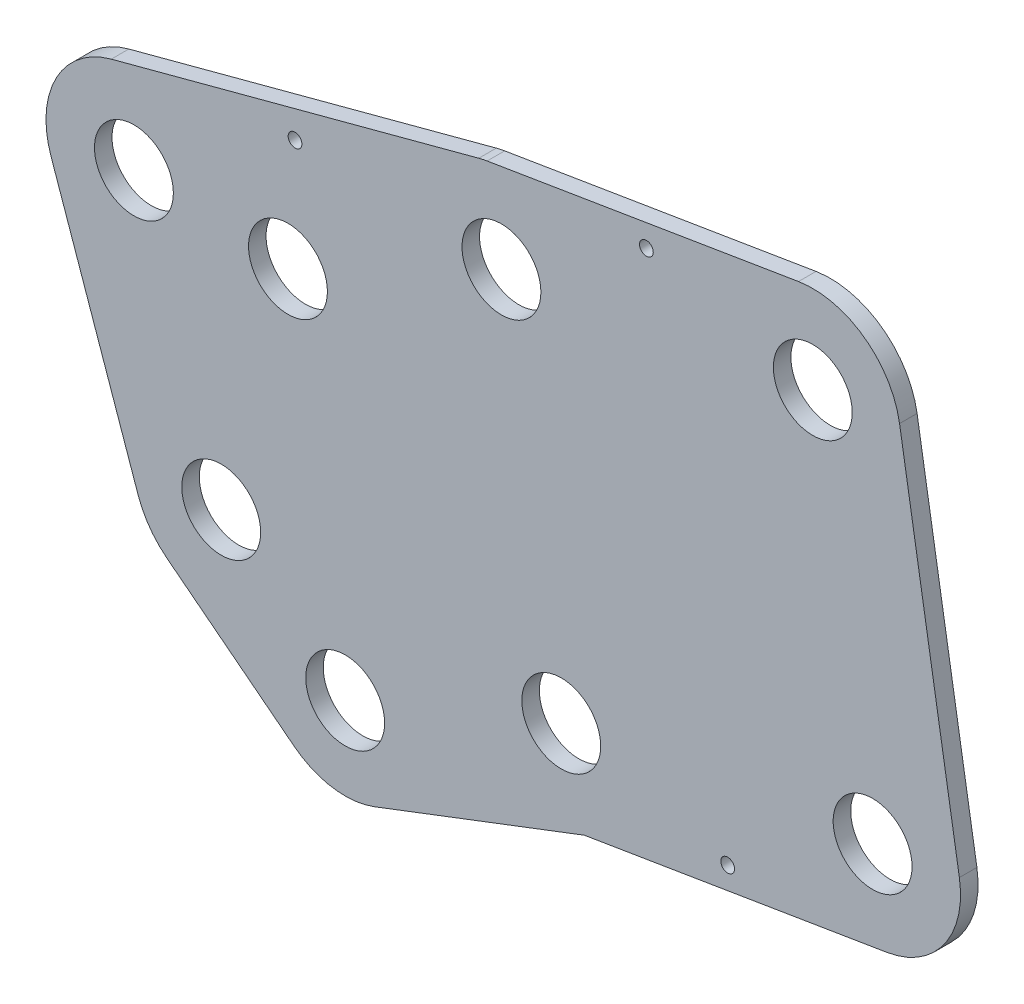
ISO-10303-21;
HEADER;
FILE_DESCRIPTION(('STEP AP214'),'2;1');
FILE_NAME('part.step','',(''),(''),'','','');
FILE_SCHEMA(('AUTOMOTIVE_DESIGN { 1 0 10303 214 1 1 1 1 }'));
ENDSEC;
DATA;
#1=APPLICATION_CONTEXT('core data for automotive mechanical design processes');
#2=APPLICATION_PROTOCOL_DEFINITION('international standard','automotive_design',2000,#1);
#3=PRODUCT_CONTEXT('',#1,'mechanical');
#4=PRODUCT('Part','Part','',(#3));
#5=PRODUCT_RELATED_PRODUCT_CATEGORY('part','',(#4));
#6=PRODUCT_DEFINITION_FORMATION('','',#4);
#7=PRODUCT_DEFINITION_CONTEXT('part definition',#1,'design');
#8=PRODUCT_DEFINITION('design','',#6,#7);
#9=PRODUCT_DEFINITION_SHAPE('','',#8);
#10=(LENGTH_UNIT() NAMED_UNIT(*) SI_UNIT(.MILLI.,.METRE.));
#11=(NAMED_UNIT(*) PLANE_ANGLE_UNIT() SI_UNIT($,.RADIAN.));
#12=(NAMED_UNIT(*) SI_UNIT($,.STERADIAN.) SOLID_ANGLE_UNIT());
#13=UNCERTAINTY_MEASURE_WITH_UNIT(LENGTH_MEASURE(1.E-05),#10,'distance_accuracy_value','');
#14=(GEOMETRIC_REPRESENTATION_CONTEXT(3) GLOBAL_UNCERTAINTY_ASSIGNED_CONTEXT((#13)) GLOBAL_UNIT_ASSIGNED_CONTEXT((#10,
#11,#12)) REPRESENTATION_CONTEXT('',''));
#15=CARTESIAN_POINT('',(0.,0.,0.));
#16=DIRECTION('',(0.,0.,1.));
#17=DIRECTION('',(1.,0.,0.));
#18=AXIS2_PLACEMENT_3D('',#15,#16,#17);
#19=CARTESIAN_POINT('',(454.475924564654,207.609022007296,3.175));
#20=DIRECTION('',(0.,0.,-1.));
#21=DIRECTION('',(-1.,0.,0.));
#22=AXIS2_PLACEMENT_3D('',#19,#20,#21);
#23=CYLINDRICAL_SURFACE('',#22,31.8516);
#24=CARTESIAN_POINT('',(454.475924564654,207.609022007296,-3.175));
#25=DIRECTION('',(0.,0.,1.));
#26=DIRECTION('',(1.,0.,0.));
#27=AXIS2_PLACEMENT_3D('',#24,#25,#26);
#28=CIRCLE('',#27,31.8516);
#29=CARTESIAN_POINT('',(424.401630244077,197.11801425402,-3.175));
#30=VERTEX_POINT('',#29);
#31=CARTESIAN_POINT('',(434.886674377582,182.493574576117,-3.175));
#32=VERTEX_POINT('',#31);
#33=EDGE_CURVE('E201',#30,#32,#28,.T.);
#34=ORIENTED_EDGE('',*,*,#33,.T.);
#35=DIRECTION('',(0.,0.,-1.));
#36=VECTOR('',#35,1.);
#37=CARTESIAN_POINT('',(434.886674377582,182.493574576117,3.175));
#38=LINE('',#37,#36);
#39=CARTESIAN_POINT('',(434.886674377582,182.493574576117,3.175));
#40=VERTEX_POINT('',#39);
#41=EDGE_CURVE('E11',#40,#32,#38,.T.);
#42=ORIENTED_EDGE('',*,*,#41,.F.);
#43=CARTESIAN_POINT('',(454.475924564654,207.609022007296,3.175));
#44=DIRECTION('',(0.,0.,1.));
#45=DIRECTION('',(1.,0.,0.));
#46=AXIS2_PLACEMENT_3D('',#43,#44,#45);
#47=CIRCLE('',#46,31.8516);
#48=CARTESIAN_POINT('',(424.401630244077,197.11801425402,3.175));
#49=VERTEX_POINT('',#48);
#50=EDGE_CURVE('E263',#49,#40,#47,.T.);
#51=ORIENTED_EDGE('',*,*,#50,.F.);
#52=DIRECTION('',(0.,0.,-1.));
#53=VECTOR('',#52,1.);
#54=CARTESIAN_POINT('',(424.401630244077,197.11801425402,3.175));
#55=LINE('',#54,#53);
#56=EDGE_CURVE('E200',#49,#30,#55,.T.);
#57=ORIENTED_EDGE('',*,*,#56,.T.);
#58=EDGE_LOOP('',(#34,#42,#51,#57));
#59=FACE_BOUND('',#58,.T.);
#60=ADVANCED_FACE('F39',(#59),#23,.T.);
#61=CARTESIAN_POINT('',(252.993790005353,324.364239193161,3.175));
#62=DIRECTION('',(0.615016206001331,0.788514468070009,0.));
#63=DIRECTION('',(-0.788514468070009,0.615016206001331,0.));
#64=AXIS2_PLACEMENT_3D('',#61,#62,#63);
#65=PLANE('',#64);
#66=DIRECTION('',(0.788514468070009,-0.615016206001331,0.));
#67=VECTOR('',#66,1.);
#68=CARTESIAN_POINT('',(252.993790005353,324.364239193161,-3.175));
#69=LINE('',#68,#67);
#70=CARTESIAN_POINT('',(480.92854649875,146.582378706157,-3.175));
#71=VERTEX_POINT('',#70);
#72=EDGE_CURVE('E204',#32,#71,#69,.T.);
#73=ORIENTED_EDGE('',*,*,#72,.T.);
#74=DIRECTION('',(0.,0.,-1.));
#75=VECTOR('',#74,1.);
#76=CARTESIAN_POINT('',(480.92854649875,146.582378706157,3.175));
#77=LINE('',#76,#75);
#78=CARTESIAN_POINT('',(480.92854649875,146.582378706157,3.175));
#79=VERTEX_POINT('',#78);
#80=EDGE_CURVE('E47',#79,#71,#77,.T.);
#81=ORIENTED_EDGE('',*,*,#80,.F.);
#82=DIRECTION('',(0.788514468070009,-0.615016206001331,0.));
#83=VECTOR('',#82,1.);
#84=CARTESIAN_POINT('',(252.993790005353,324.364239193161,3.175));
#85=LINE('',#84,#83);
#86=EDGE_CURVE('E112',#40,#79,#85,.T.);
#87=ORIENTED_EDGE('',*,*,#86,.F.);
#88=ORIENTED_EDGE('',*,*,#41,.T.);
#89=EDGE_LOOP('',(#73,#81,#87,#88));
#90=FACE_BOUND('',#89,.T.);
#91=ADVANCED_FACE('F341',(#90),#65,.F.);
#92=CARTESIAN_POINT('',(499.379032644349,170.237812704101,3.175));
#93=DIRECTION('',(0.,0.,-1.));
#94=DIRECTION('',(-1.,0.,0.));
#95=AXIS2_PLACEMENT_3D('',#92,#93,#94);
#96=CYLINDRICAL_SURFACE('',#95,29.9999999440008);
#97=CARTESIAN_POINT('',(499.379032644349,170.237812704101,-3.175));
#98=DIRECTION('',(0.,0.,1.));
#99=DIRECTION('',(1.,0.,0.));
#100=AXIS2_PLACEMENT_3D('',#97,#98,#99);
#101=CIRCLE('',#100,29.9999999440008);
#102=CARTESIAN_POINT('',(510.094718853488,142.216855088286,-3.175));
#103=VERTEX_POINT('',#102);
#104=EDGE_CURVE('E206',#71,#103,#101,.T.);
#105=ORIENTED_EDGE('',*,*,#104,.T.);
#106=DIRECTION('',(0.,0.,-1.));
#107=VECTOR('',#106,1.);
#108=CARTESIAN_POINT('',(510.094718853488,142.216855088286,3.175));
#109=LINE('',#108,#107);
#110=CARTESIAN_POINT('',(510.094718853488,142.216855088286,3.175));
#111=VERTEX_POINT('',#110);
#112=EDGE_CURVE('E281',#111,#103,#109,.T.);
#113=ORIENTED_EDGE('',*,*,#112,.F.);
#114=CARTESIAN_POINT('',(499.379032644349,170.237812704101,3.175));
#115=DIRECTION('',(0.,0.,1.));
#116=DIRECTION('',(1.,0.,0.));
#117=AXIS2_PLACEMENT_3D('',#114,#115,#116);
#118=CIRCLE('',#117,29.9999999440008);
#119=EDGE_CURVE('E289',#79,#111,#118,.T.);
#120=ORIENTED_EDGE('',*,*,#119,.F.);
#121=ORIENTED_EDGE('',*,*,#80,.T.);
#122=EDGE_LOOP('',(#105,#113,#120,#121));
#123=FACE_BOUND('',#122,.T.);
#124=ADVANCED_FACE('F287',(#123),#96,.T.);
#125=CARTESIAN_POINT('',(17.6328102601143,-46.1088743458141,3.175));
#126=DIRECTION('',(-0.357189540971386,0.934031922270674,0.));
#127=DIRECTION('',(-0.934031922270674,-0.357189540971386,0.));
#128=AXIS2_PLACEMENT_3D('',#125,#126,#127);
#129=PLANE('',#128);
#130=DIRECTION('',(0.934031922270674,0.357189540971386,0.));
#131=VECTOR('',#130,1.);
#132=CARTESIAN_POINT('',(17.6328102601143,-46.1088743458141,-3.175));
#133=LINE('',#132,#131);
#134=CARTESIAN_POINT('',(586.011316137788,171.248640715235,-3.175));
#135=VERTEX_POINT('',#134);
#136=EDGE_CURVE('E208',#103,#135,#133,.T.);
#137=ORIENTED_EDGE('',*,*,#136,.T.);
#138=DIRECTION('',(0.,0.,-1.));
#139=VECTOR('',#138,1.);
#140=CARTESIAN_POINT('',(586.011316137788,171.248640715235,3.175));
#141=LINE('',#140,#139);
#142=CARTESIAN_POINT('',(586.011316137788,171.248640715235,3.175));
#143=VERTEX_POINT('',#142);
#144=EDGE_CURVE('E278',#143,#135,#141,.T.);
#145=ORIENTED_EDGE('',*,*,#144,.F.);
#146=DIRECTION('',(0.934031922270674,0.357189540971386,0.));
#147=VECTOR('',#146,1.);
#148=CARTESIAN_POINT('',(17.6328102601143,-46.1088743458141,3.175));
#149=LINE('',#148,#147);
#150=EDGE_CURVE('E308',#111,#143,#149,.T.);
#151=ORIENTED_EDGE('',*,*,#150,.F.);
#152=ORIENTED_EDGE('',*,*,#112,.T.);
#153=EDGE_LOOP('',(#137,#145,#151,#152));
#154=FACE_BOUND('',#153,.T.);
#155=ADVANCED_FACE('F299',(#154),#129,.F.);
#156=CARTESIAN_POINT('',(-11.9836694249742,72.7654708006961,3.175));
#157=DIRECTION('',(-0.162500000001427,0.986708543593059,0.));
#158=DIRECTION('',(-0.986708543593059,-0.162500000001427,0.));
#159=AXIS2_PLACEMENT_3D('',#156,#157,#158);
#160=PLANE('',#159);
#161=DIRECTION('',(0.986708543593059,0.162500000001427,0.));
#162=VECTOR('',#161,1.);
#163=CARTESIAN_POINT('',(-11.9836694249742,72.7654708006961,-3.175));
#164=LINE('',#163,#162);
#165=CARTESIAN_POINT('',(695.606481881925,189.297754153259,-3.175));
#166=VERTEX_POINT('',#165);
#167=EDGE_CURVE('E210',#135,#166,#164,.T.);
#168=ORIENTED_EDGE('',*,*,#167,.T.);
#169=DIRECTION('',(0.,0.,-1.));
#170=VECTOR('',#169,1.);
#171=CARTESIAN_POINT('',(695.606481881925,189.297754153259,3.175));
#172=LINE('',#171,#170);
#173=CARTESIAN_POINT('',(695.606481881925,189.297754153259,3.175));
#174=VERTEX_POINT('',#173);
#175=EDGE_CURVE('E275',#174,#166,#172,.T.);
#176=ORIENTED_EDGE('',*,*,#175,.F.);
#177=DIRECTION('',(0.986708543593059,0.162500000001427,0.));
#178=VECTOR('',#177,1.);
#179=CARTESIAN_POINT('',(-11.9836694249742,72.7654708006961,3.175));
#180=LINE('',#179,#178);
#181=EDGE_CURVE('E305',#143,#174,#180,.T.);
#182=ORIENTED_EDGE('',*,*,#181,.F.);
#183=ORIENTED_EDGE('',*,*,#144,.T.);
#184=EDGE_LOOP('',(#168,#176,#182,#183));
#185=FACE_BOUND('',#184,.T.);
#186=ADVANCED_FACE('F303',(#185),#160,.F.);
#187=CARTESIAN_POINT('',(690.430596881879,220.726000000367,3.175));
#188=DIRECTION('',(0.,0.,-1.));
#189=DIRECTION('',(-1.,0.,0.));
#190=AXIS2_PLACEMENT_3D('',#187,#188,#189);
#191=CYLINDRICAL_SURFACE('',#190,31.8515999999999);
#192=CARTESIAN_POINT('',(690.430596881879,220.726000000367,-3.175));
#193=DIRECTION('',(0.,0.,1.));
#194=DIRECTION('',(1.,0.,0.));
#195=AXIS2_PLACEMENT_3D('',#192,#193,#194);
#196=CIRCLE('',#195,31.8515999999999);
#197=CARTESIAN_POINT('',(721.858842728988,225.901885000413,-3.175));
#198=VERTEX_POINT('',#197);
#199=EDGE_CURVE('E212',#166,#198,#196,.T.);
#200=ORIENTED_EDGE('',*,*,#199,.T.);
#201=DIRECTION('',(0.,0.,-1.));
#202=VECTOR('',#201,1.);
#203=CARTESIAN_POINT('',(721.858842728988,225.901885000413,3.175));
#204=LINE('',#203,#202);
#205=CARTESIAN_POINT('',(721.858842728988,225.901885000413,3.175));
#206=VERTEX_POINT('',#205);
#207=EDGE_CURVE('E273',#206,#198,#204,.T.);
#208=ORIENTED_EDGE('',*,*,#207,.F.);
#209=CARTESIAN_POINT('',(690.430596881879,220.726000000367,3.175));
#210=DIRECTION('',(0.,0.,1.));
#211=DIRECTION('',(1.,0.,0.));
#212=AXIS2_PLACEMENT_3D('',#209,#210,#211);
#213=CIRCLE('',#212,31.8515999999999);
#214=EDGE_CURVE('E307',#174,#206,#213,.T.);
#215=ORIENTED_EDGE('',*,*,#214,.F.);
#216=ORIENTED_EDGE('',*,*,#175,.T.);
#217=EDGE_LOOP('',(#200,#208,#215,#216));
#218=FACE_BOUND('',#217,.T.);
#219=ADVANCED_FACE('F564',(#218),#191,.T.);
#220=CARTESIAN_POINT('',(739.018397154007,121.708168352606,3.175));
#221=DIRECTION('',(0.98670854359306,0.162500000001424,0.));
#222=DIRECTION('',(-0.162500000001424,0.98670854359306,0.));
#223=AXIS2_PLACEMENT_3D('',#220,#221,#222);
#224=PLANE('',#223);
#225=DIRECTION('',(0.162500000001424,-0.98670854359306,0.));
#226=VECTOR('',#225,1.);
#227=CARTESIAN_POINT('',(739.018397154007,121.708168352606,-3.175));
#228=LINE('',#227,#226);
#229=CARTESIAN_POINT('',(700.189467728798,357.479469288547,-3.175));
#230=VERTEX_POINT('',#229);
#231=EDGE_CURVE('E215',#230,#198,#228,.T.);
#232=ORIENTED_EDGE('',*,*,#231,.F.);
#233=DIRECTION('',(0.,0.,-1.));
#234=VECTOR('',#233,1.);
#235=CARTESIAN_POINT('',(700.189467728798,357.479469288547,3.175));
#236=LINE('',#235,#234);
#237=CARTESIAN_POINT('',(700.189467728798,357.479469288547,3.175));
#238=VERTEX_POINT('',#237);
#239=EDGE_CURVE('E271',#238,#230,#236,.T.);
#240=ORIENTED_EDGE('',*,*,#239,.F.);
#241=DIRECTION('',(0.162500000001424,-0.98670854359306,0.));
#242=VECTOR('',#241,1.);
#243=CARTESIAN_POINT('',(739.018397154007,121.708168352606,3.175));
#244=LINE('',#243,#242);
#245=EDGE_CURVE('E310',#238,#206,#244,.T.);
#246=ORIENTED_EDGE('',*,*,#245,.T.);
#247=ORIENTED_EDGE('',*,*,#207,.T.);
#248=EDGE_LOOP('',(#232,#240,#246,#247));
#249=FACE_BOUND('',#248,.T.);
#250=ADVANCED_FACE('F554',(#249),#224,.T.);
#251=CARTESIAN_POINT('',(668.761221881689,352.303584288502,3.175));
#252=DIRECTION('',(0.,0.,-1.));
#253=DIRECTION('',(-1.,0.,0.));
#254=AXIS2_PLACEMENT_3D('',#251,#252,#253);
#255=CYLINDRICAL_SURFACE('',#254,31.8515999999999);
#256=CARTESIAN_POINT('',(668.761221881689,352.303584288502,-3.175));
#257=DIRECTION('',(0.,0.,1.));
#258=DIRECTION('',(1.,0.,0.));
#259=AXIS2_PLACEMENT_3D('',#256,#257,#258);
#260=CIRCLE('',#259,31.8515999999999);
#261=CARTESIAN_POINT('',(663.585336881644,383.73183013561,-3.175));
#262=VERTEX_POINT('',#261);
#263=EDGE_CURVE('E218',#230,#262,#260,.T.);
#264=ORIENTED_EDGE('',*,*,#263,.T.);
#265=DIRECTION('',(0.,0.,-1.));
#266=VECTOR('',#265,1.);
#267=CARTESIAN_POINT('',(663.585336881644,383.73183013561,3.175));
#268=LINE('',#267,#266);
#269=CARTESIAN_POINT('',(663.585336881644,383.73183013561,3.175));
#270=VERTEX_POINT('',#269);
#271=EDGE_CURVE('E269',#270,#262,#268,.T.);
#272=ORIENTED_EDGE('',*,*,#271,.F.);
#273=CARTESIAN_POINT('',(668.761221881689,352.303584288502,3.175));
#274=DIRECTION('',(0.,0.,1.));
#275=DIRECTION('',(1.,0.,0.));
#276=AXIS2_PLACEMENT_3D('',#273,#274,#275);
#277=CIRCLE('',#276,31.8515999999999);
#278=EDGE_CURVE('E317',#238,#270,#277,.T.);
#279=ORIENTED_EDGE('',*,*,#278,.F.);
#280=ORIENTED_EDGE('',*,*,#239,.T.);
#281=EDGE_LOOP('',(#264,#272,#279,#280));
#282=FACE_BOUND('',#281,.T.);
#283=ADVANCED_FACE('F326',(#282),#255,.T.);
#284=CARTESIAN_POINT('',(-44.0048144252552,267.199546783048,3.175));
#285=DIRECTION('',(-0.162500000001426,0.986708543593059,0.));
#286=DIRECTION('',(-0.986708543593059,-0.162500000001426,0.));
#287=AXIS2_PLACEMENT_3D('',#284,#285,#286);
#288=PLANE('',#287);
#289=DIRECTION('',(0.98670854359306,0.162500000001426,0.));
#290=VECTOR('',#289,1.);
#291=CARTESIAN_POINT('',(-44.0048144252552,267.199546783048,-3.175));
#292=LINE('',#291,#290);
#293=CARTESIAN_POINT('',(550.804550348957,365.158080135447,-3.175));
#294=VERTEX_POINT('',#293);
#295=EDGE_CURVE('E221',#294,#262,#292,.T.);
#296=ORIENTED_EDGE('',*,*,#295,.F.);
#297=DIRECTION('',(0.,0.,-1.));
#298=VECTOR('',#297,1.);
#299=CARTESIAN_POINT('',(550.804550348957,365.158080135447,3.175));
#300=LINE('',#299,#298);
#301=CARTESIAN_POINT('',(550.804550348957,365.158080135447,3.175));
#302=VERTEX_POINT('',#301);
#303=EDGE_CURVE('E267',#302,#294,#300,.T.);
#304=ORIENTED_EDGE('',*,*,#303,.F.);
#305=DIRECTION('',(0.98670854359306,0.162500000001426,0.));
#306=VECTOR('',#305,1.);
#307=CARTESIAN_POINT('',(-44.0048144252552,267.199546783048,3.175));
#308=LINE('',#307,#306);
#309=EDGE_CURVE('E162',#302,#270,#308,.T.);
#310=ORIENTED_EDGE('',*,*,#309,.T.);
#311=ORIENTED_EDGE('',*,*,#271,.T.);
#312=EDGE_LOOP('',(#296,#304,#310,#311));
#313=FACE_BOUND('',#312,.T.);
#314=ADVANCED_FACE('F321',(#313),#288,.T.);
#315=CARTESIAN_POINT('',(555.980435349002,333.729834288339,3.175));
#316=DIRECTION('',(0.,0.,-1.));
#317=DIRECTION('',(-1.,0.,0.));
#318=AXIS2_PLACEMENT_3D('',#315,#316,#317);
#319=CYLINDRICAL_SURFACE('',#318,31.8515999999999);
#320=CARTESIAN_POINT('',(555.980435349002,333.729834288339,-3.175));
#321=DIRECTION('',(0.,0.,1.));
#322=DIRECTION('',(1.,0.,0.));
#323=AXIS2_PLACEMENT_3D('',#320,#321,#322);
#324=CIRCLE('',#323,31.8515999999999);
#325=CARTESIAN_POINT('',(547.778598198655,364.507330773907,-3.175));
#326=VERTEX_POINT('',#325);
#327=EDGE_CURVE('E224',#294,#326,#324,.T.);
#328=ORIENTED_EDGE('',*,*,#327,.T.);
#329=DIRECTION('',(0.,0.,-1.));
#330=VECTOR('',#329,1.);
#331=CARTESIAN_POINT('',(547.778598198655,364.507330773907,3.175));
#332=LINE('',#331,#330);
#333=CARTESIAN_POINT('',(547.778598198655,364.507330773907,3.175));
#334=VERTEX_POINT('',#333);
#335=EDGE_CURVE('E149',#334,#326,#332,.T.);
#336=ORIENTED_EDGE('',*,*,#335,.F.);
#337=CARTESIAN_POINT('',(555.980435349002,333.729834288339,3.175));
#338=DIRECTION('',(0.,0.,1.));
#339=DIRECTION('',(1.,0.,0.));
#340=AXIS2_PLACEMENT_3D('',#337,#338,#339);
#341=CIRCLE('',#340,31.8515999999999);
#342=EDGE_CURVE('E159',#302,#334,#341,.T.);
#343=ORIENTED_EDGE('',*,*,#342,.F.);
#344=ORIENTED_EDGE('',*,*,#303,.T.);
#345=EDGE_LOOP('',(#328,#336,#343,#344));
#346=FACE_BOUND('',#345,.T.);
#347=ADVANCED_FACE('F331',(#346),#319,.T.);
#348=CARTESIAN_POINT('',(-54.3744235872809,204.040704562343,3.175));
#349=DIRECTION('',(-0.257501574500081,0.966277878837128,0.));
#350=DIRECTION('',(-0.966277878837128,-0.257501574500081,0.));
#351=AXIS2_PLACEMENT_3D('',#348,#349,#350);
#352=PLANE('',#351);
#353=DIRECTION('',(0.966277878837128,0.257501574500081,0.));
#354=VECTOR('',#353,1.);
#355=CARTESIAN_POINT('',(-54.3744235872809,204.040704562343,-3.175));
#356=LINE('',#355,#354);
#357=CARTESIAN_POINT('',(414.653929587534,329.031188224292,-3.175));
#358=VERTEX_POINT('',#357);
#359=EDGE_CURVE('E148',#358,#326,#356,.T.);
#360=ORIENTED_EDGE('',*,*,#359,.F.);
#361=DIRECTION('',(0.,0.,-1.));
#362=VECTOR('',#361,1.);
#363=CARTESIAN_POINT('',(414.653929587534,329.031188224292,3.175));
#364=LINE('',#363,#362);
#365=CARTESIAN_POINT('',(414.653929587534,329.031188224292,3.175));
#366=VERTEX_POINT('',#365);
#367=EDGE_CURVE('E142',#366,#358,#364,.T.);
#368=ORIENTED_EDGE('',*,*,#367,.F.);
#369=DIRECTION('',(0.966277878837128,0.257501574500081,0.));
#370=VECTOR('',#369,1.);
#371=CARTESIAN_POINT('',(-54.3744235872809,204.040704562343,3.175));
#372=LINE('',#371,#370);
#373=EDGE_CURVE('E146',#366,#334,#372,.T.);
#374=ORIENTED_EDGE('',*,*,#373,.T.);
#375=ORIENTED_EDGE('',*,*,#335,.T.);
#376=EDGE_LOOP('',(#360,#368,#374,#375));
#377=FACE_BOUND('',#376,.T.);
#378=ADVANCED_FACE('F144',(#377),#352,.T.);
#379=CARTESIAN_POINT('',(422.85576673788,298.253691738724,3.175));
#380=DIRECTION('',(0.,0.,-1.));
#381=DIRECTION('',(-1.,0.,0.));
#382=AXIS2_PLACEMENT_3D('',#379,#380,#381);
#383=CYLINDRICAL_SURFACE('',#382,31.8516);
#384=CARTESIAN_POINT('',(422.85576673788,298.253691738724,-3.175));
#385=DIRECTION('',(0.,0.,1.));
#386=DIRECTION('',(1.,0.,0.));
#387=AXIS2_PLACEMENT_3D('',#384,#385,#386);
#388=CIRCLE('',#387,31.8516);
#389=CARTESIAN_POINT('',(392.781472417303,287.762683985448,-3.175));
#390=VERTEX_POINT('',#389);
#391=EDGE_CURVE('E98',#358,#390,#388,.T.);
#392=ORIENTED_EDGE('',*,*,#391,.T.);
#393=DIRECTION('',(0.,0.,-1.));
#394=VECTOR('',#393,1.);
#395=CARTESIAN_POINT('',(392.781472417303,287.762683985448,3.175));
#396=LINE('',#395,#394);
#397=CARTESIAN_POINT('',(392.781472417303,287.762683985448,3.175));
#398=VERTEX_POINT('',#397);
#399=EDGE_CURVE('E150',#398,#390,#396,.T.);
#400=ORIENTED_EDGE('',*,*,#399,.F.);
#401=CARTESIAN_POINT('',(422.85576673788,298.253691738724,3.175));
#402=DIRECTION('',(0.,0.,1.));
#403=DIRECTION('',(1.,0.,0.));
#404=AXIS2_PLACEMENT_3D('',#401,#402,#403);
#405=CIRCLE('',#404,31.8516);
#406=EDGE_CURVE('E152',#366,#398,#405,.T.);
#407=ORIENTED_EDGE('',*,*,#406,.F.);
#408=ORIENTED_EDGE('',*,*,#367,.T.);
#409=EDGE_LOOP('',(#392,#400,#407,#408));
#410=FACE_BOUND('',#409,.T.);
#411=ADVANCED_FACE('F153',(#410),#383,.T.);
#412=CARTESIAN_POINT('',(499.379032644349,170.237812704101,3.175));
#413=DIRECTION('',(0.,0.,-1.));
#414=DIRECTION('',(-1.,0.,0.));
#415=AXIS2_PLACEMENT_3D('',#412,#413,#414);
#416=CYLINDRICAL_SURFACE('',#415,14.2875000000003);
#417=CARTESIAN_POINT('',(499.379032644349,170.237812704101,3.175));
#418=DIRECTION('',(0.,0.,1.));
#419=DIRECTION('',(1.,0.,0.));
#420=AXIS2_PLACEMENT_3D('',#417,#418,#419);
#421=CIRCLE('',#420,14.2875000000003);
#422=CARTESIAN_POINT('',(513.666532644349,170.237812704101,3.175));
#423=VERTEX_POINT('',#422);
#424=EDGE_CURVE('E194',#423,#423,#421,.T.);
#425=ORIENTED_EDGE('',*,*,#424,.T.);
#426=EDGE_LOOP('',(#425));
#427=FACE_BOUND('',#426,.T.);
#428=CARTESIAN_POINT('',(499.379032644349,170.237812704101,-3.175));
#429=DIRECTION('',(0.,0.,1.));
#430=DIRECTION('',(1.,0.,0.));
#431=AXIS2_PLACEMENT_3D('',#428,#429,#430);
#432=CIRCLE('',#431,14.2875000000003);
#433=CARTESIAN_POINT('',(513.666532644349,170.237812704101,-3.175));
#434=VERTEX_POINT('',#433);
#435=EDGE_CURVE('E257',#434,#434,#432,.T.);
#436=ORIENTED_EDGE('',*,*,#435,.F.);
#437=EDGE_LOOP('',(#436));
#438=FACE_BOUND('',#437,.T.);
#439=ADVANCED_FACE('F365',(#427,#438),#416,.F.);
#440=CARTESIAN_POINT('',(577.649810349193,202.152250000204,3.175));
#441=DIRECTION('',(0.,0.,-1.));
#442=DIRECTION('',(-1.,0.,0.));
#443=AXIS2_PLACEMENT_3D('',#440,#441,#442);
#444=CYLINDRICAL_SURFACE('',#443,14.2875);
#445=CARTESIAN_POINT('',(577.649810349193,202.152250000204,3.175));
#446=DIRECTION('',(0.,0.,1.));
#447=DIRECTION('',(1.,0.,0.));
#448=AXIS2_PLACEMENT_3D('',#445,#446,#447);
#449=CIRCLE('',#448,14.2875);
#450=CARTESIAN_POINT('',(591.937310349193,202.152250000204,3.175));
#451=VERTEX_POINT('',#450);
#452=EDGE_CURVE('E191',#451,#451,#449,.T.);
#453=ORIENTED_EDGE('',*,*,#452,.T.);
#454=EDGE_LOOP('',(#453));
#455=FACE_BOUND('',#454,.T.);
#456=CARTESIAN_POINT('',(577.649810349193,202.152250000204,-3.175));
#457=DIRECTION('',(0.,0.,1.));
#458=DIRECTION('',(1.,0.,0.));
#459=AXIS2_PLACEMENT_3D('',#456,#457,#458);
#460=CIRCLE('',#459,14.2875);
#461=CARTESIAN_POINT('',(591.937310349193,202.152250000204,-3.175));
#462=VERTEX_POINT('',#461);
#463=EDGE_CURVE('E254',#462,#462,#460,.T.);
#464=ORIENTED_EDGE('',*,*,#463,.F.);
#465=EDGE_LOOP('',(#464));
#466=FACE_BOUND('',#465,.T.);
#467=ADVANCED_FACE('F369',(#455,#466),#444,.F.);
#468=CARTESIAN_POINT('',(690.430596881879,220.726000000367,3.175));
#469=DIRECTION('',(0.,0.,-1.));
#470=DIRECTION('',(-1.,0.,0.));
#471=AXIS2_PLACEMENT_3D('',#468,#469,#470);
#472=CYLINDRICAL_SURFACE('',#471,14.2875);
#473=CARTESIAN_POINT('',(690.430596881879,220.726000000367,3.175));
#474=DIRECTION('',(0.,0.,1.));
#475=DIRECTION('',(1.,0.,0.));
#476=AXIS2_PLACEMENT_3D('',#473,#474,#475);
#477=CIRCLE('',#476,14.2875);
#478=CARTESIAN_POINT('',(704.718096881879,220.726000000367,3.175));
#479=VERTEX_POINT('',#478);
#480=EDGE_CURVE('E188',#479,#479,#477,.T.);
#481=ORIENTED_EDGE('',*,*,#480,.T.);
#482=EDGE_LOOP('',(#481));
#483=FACE_BOUND('',#482,.T.);
#484=CARTESIAN_POINT('',(690.430596881879,220.726000000367,-3.175));
#485=DIRECTION('',(0.,0.,1.));
#486=DIRECTION('',(1.,0.,0.));
#487=AXIS2_PLACEMENT_3D('',#484,#485,#486);
#488=CIRCLE('',#487,14.2875);
#489=CARTESIAN_POINT('',(704.718096881879,220.726000000367,-3.175));
#490=VERTEX_POINT('',#489);
#491=EDGE_CURVE('E251',#490,#490,#488,.T.);
#492=ORIENTED_EDGE('',*,*,#491,.F.);
#493=EDGE_LOOP('',(#492));
#494=FACE_BOUND('',#493,.T.);
#495=ADVANCED_FACE('F375',(#483,#494),#472,.F.);
#496=CARTESIAN_POINT('',(668.761221881689,352.303584288502,3.175));
#497=DIRECTION('',(0.,0.,-1.));
#498=DIRECTION('',(-1.,0.,0.));
#499=AXIS2_PLACEMENT_3D('',#496,#497,#498);
#500=CYLINDRICAL_SURFACE('',#499,14.2875);
#501=CARTESIAN_POINT('',(668.761221881689,352.303584288502,3.175));
#502=DIRECTION('',(0.,0.,1.));
#503=DIRECTION('',(1.,0.,0.));
#504=AXIS2_PLACEMENT_3D('',#501,#502,#503);
#505=CIRCLE('',#504,14.2875);
#506=CARTESIAN_POINT('',(683.048721881689,352.303584288502,3.175));
#507=VERTEX_POINT('',#506);
#508=EDGE_CURVE('E185',#507,#507,#505,.T.);
#509=ORIENTED_EDGE('',*,*,#508,.T.);
#510=EDGE_LOOP('',(#509));
#511=FACE_BOUND('',#510,.T.);
#512=CARTESIAN_POINT('',(668.761221881689,352.303584288502,-3.175));
#513=DIRECTION('',(0.,0.,1.));
#514=DIRECTION('',(1.,0.,0.));
#515=AXIS2_PLACEMENT_3D('',#512,#513,#514);
#516=CIRCLE('',#515,14.2875);
#517=CARTESIAN_POINT('',(683.048721881689,352.303584288502,-3.175));
#518=VERTEX_POINT('',#517);
#519=EDGE_CURVE('E248',#518,#518,#516,.T.);
#520=ORIENTED_EDGE('',*,*,#519,.F.);
#521=EDGE_LOOP('',(#520));
#522=FACE_BOUND('',#521,.T.);
#523=ADVANCED_FACE('F383',(#511,#522),#500,.F.);
#524=CARTESIAN_POINT('',(555.980435349002,333.729834288339,3.175));
#525=DIRECTION('',(0.,0.,-1.));
#526=DIRECTION('',(-1.,0.,0.));
#527=AXIS2_PLACEMENT_3D('',#524,#525,#526);
#528=CYLINDRICAL_SURFACE('',#527,14.2875);
#529=CARTESIAN_POINT('',(555.980435349002,333.729834288339,3.175));
#530=DIRECTION('',(0.,0.,1.));
#531=DIRECTION('',(1.,0.,0.));
#532=AXIS2_PLACEMENT_3D('',#529,#530,#531);
#533=CIRCLE('',#532,14.2875);
#534=CARTESIAN_POINT('',(570.267935349002,333.729834288339,3.175));
#535=VERTEX_POINT('',#534);
#536=EDGE_CURVE('E182',#535,#535,#533,.T.);
#537=ORIENTED_EDGE('',*,*,#536,.T.);
#538=EDGE_LOOP('',(#537));
#539=FACE_BOUND('',#538,.T.);
#540=CARTESIAN_POINT('',(555.980435349002,333.729834288339,-3.175));
#541=DIRECTION('',(0.,0.,1.));
#542=DIRECTION('',(1.,0.,0.));
#543=AXIS2_PLACEMENT_3D('',#540,#541,#542);
#544=CIRCLE('',#543,14.2875);
#545=CARTESIAN_POINT('',(570.267935349002,333.729834288339,-3.175));
#546=VERTEX_POINT('',#545);
#547=EDGE_CURVE('E245',#546,#546,#544,.T.);
#548=ORIENTED_EDGE('',*,*,#547,.F.);
#549=EDGE_LOOP('',(#548));
#550=FACE_BOUND('',#549,.T.);
#551=ADVANCED_FACE('F387',(#539,#550),#528,.F.);
#552=CARTESIAN_POINT('',(422.85576673788,298.253691738724,3.175));
#553=DIRECTION('',(0.,0.,-1.));
#554=DIRECTION('',(-1.,0.,0.));
#555=AXIS2_PLACEMENT_3D('',#552,#553,#554);
#556=CYLINDRICAL_SURFACE('',#555,14.2875);
#557=CARTESIAN_POINT('',(422.85576673788,298.253691738724,3.175));
#558=DIRECTION('',(0.,0.,1.));
#559=DIRECTION('',(1.,0.,0.));
#560=AXIS2_PLACEMENT_3D('',#557,#558,#559);
#561=CIRCLE('',#560,14.2875);
#562=CARTESIAN_POINT('',(437.14326673788,298.253691738724,3.175));
#563=VERTEX_POINT('',#562);
#564=EDGE_CURVE('E179',#563,#563,#561,.T.);
#565=ORIENTED_EDGE('',*,*,#564,.T.);
#566=EDGE_LOOP('',(#565));
#567=FACE_BOUND('',#566,.T.);
#568=CARTESIAN_POINT('',(422.85576673788,298.253691738724,-3.175));
#569=DIRECTION('',(0.,0.,1.));
#570=DIRECTION('',(1.,0.,0.));
#571=AXIS2_PLACEMENT_3D('',#568,#569,#570);
#572=CIRCLE('',#571,14.2875);
#573=CARTESIAN_POINT('',(437.14326673788,298.253691738724,-3.175));
#574=VERTEX_POINT('',#573);
#575=EDGE_CURVE('E242',#574,#574,#572,.T.);
#576=ORIENTED_EDGE('',*,*,#575,.F.);
#577=EDGE_LOOP('',(#576));
#578=FACE_BOUND('',#577,.T.);
#579=ADVANCED_FACE('F391',(#567,#578),#556,.F.);
#580=CARTESIAN_POINT('',(478.655145075432,295.253062280957,3.175));
#581=DIRECTION('',(0.,0.,-1.));
#582=DIRECTION('',(-1.,0.,0.));
#583=AXIS2_PLACEMENT_3D('',#580,#581,#582);
#584=CYLINDRICAL_SURFACE('',#583,14.2875);
#585=CARTESIAN_POINT('',(478.655145075432,295.253062280957,3.175));
#586=DIRECTION('',(0.,0.,1.));
#587=DIRECTION('',(1.,0.,0.));
#588=AXIS2_PLACEMENT_3D('',#585,#586,#587);
#589=CIRCLE('',#588,14.2875);
#590=CARTESIAN_POINT('',(492.942645075432,295.253062280957,3.175));
#591=VERTEX_POINT('',#590);
#592=EDGE_CURVE('E176',#591,#591,#589,.T.);
#593=ORIENTED_EDGE('',*,*,#592,.T.);
#594=EDGE_LOOP('',(#593));
#595=FACE_BOUND('',#594,.T.);
#596=CARTESIAN_POINT('',(478.655145075432,295.253062280957,-3.175));
#597=DIRECTION('',(0.,0.,1.));
#598=DIRECTION('',(1.,0.,0.));
#599=AXIS2_PLACEMENT_3D('',#596,#597,#598);
#600=CIRCLE('',#599,14.2875);
#601=CARTESIAN_POINT('',(492.942645075432,295.253062280957,-3.175));
#602=VERTEX_POINT('',#601);
#603=EDGE_CURVE('E239',#602,#602,#600,.T.);
#604=ORIENTED_EDGE('',*,*,#603,.F.);
#605=EDGE_LOOP('',(#604));
#606=FACE_BOUND('',#605,.T.);
#607=ADVANCED_FACE('F395',(#595,#606),#584,.F.);
#608=CARTESIAN_POINT('',(481.216263893094,336.911846627905,3.175));
#609=DIRECTION('',(0.,0.,-1.));
#610=DIRECTION('',(-1.,0.,0.));
#611=AXIS2_PLACEMENT_3D('',#608,#609,#610);
#612=CYLINDRICAL_SURFACE('',#611,2.48920000000001);
#613=CARTESIAN_POINT('',(481.216263893094,336.911846627905,3.175));
#614=DIRECTION('',(0.,0.,1.));
#615=DIRECTION('',(1.,0.,0.));
#616=AXIS2_PLACEMENT_3D('',#613,#614,#615);
#617=CIRCLE('',#616,2.48920000000001);
#618=CARTESIAN_POINT('',(483.705463893095,336.911846627905,3.175));
#619=VERTEX_POINT('',#618);
#620=EDGE_CURVE('E173',#619,#619,#617,.T.);
#621=ORIENTED_EDGE('',*,*,#620,.T.);
#622=EDGE_LOOP('',(#621));
#623=FACE_BOUND('',#622,.T.);
#624=CARTESIAN_POINT('',(481.216263893094,336.911846627905,-3.175));
#625=DIRECTION('',(0.,0.,1.));
#626=DIRECTION('',(1.,0.,0.));
#627=AXIS2_PLACEMENT_3D('',#624,#625,#626);
#628=CIRCLE('',#627,2.48920000000001);
#629=CARTESIAN_POINT('',(483.705463893095,336.911846627905,-3.175));
#630=VERTEX_POINT('',#629);
#631=EDGE_CURVE('E236',#630,#630,#628,.T.);
#632=ORIENTED_EDGE('',*,*,#631,.F.);
#633=EDGE_LOOP('',(#632));
#634=FACE_BOUND('',#633,.T.);
#635=ADVANCED_FACE('F399',(#623,#634),#612,.F.);
#636=CARTESIAN_POINT('',(637.92624486557,187.842878217947,3.175));
#637=DIRECTION('',(0.,0.,-1.));
#638=DIRECTION('',(-1.,0.,0.));
#639=AXIS2_PLACEMENT_3D('',#636,#637,#638);
#640=CYLINDRICAL_SURFACE('',#639,2.48919999999995);
#641=CARTESIAN_POINT('',(637.92624486557,187.842878217947,3.175));
#642=DIRECTION('',(0.,0.,1.));
#643=DIRECTION('',(1.,0.,0.));
#644=AXIS2_PLACEMENT_3D('',#641,#642,#643);
#645=CIRCLE('',#644,2.48919999999995);
#646=CARTESIAN_POINT('',(640.41544486557,187.842878217947,3.175));
#647=VERTEX_POINT('',#646);
#648=EDGE_CURVE('E170',#647,#647,#645,.T.);
#649=ORIENTED_EDGE('',*,*,#648,.T.);
#650=EDGE_LOOP('',(#649));
#651=FACE_BOUND('',#650,.T.);
#652=CARTESIAN_POINT('',(637.92624486557,187.842878217947,-3.175));
#653=DIRECTION('',(0.,0.,1.));
#654=DIRECTION('',(1.,0.,0.));
#655=AXIS2_PLACEMENT_3D('',#652,#653,#654);
#656=CIRCLE('',#655,2.48919999999995);
#657=CARTESIAN_POINT('',(640.41544486557,187.842878217947,-3.175));
#658=VERTEX_POINT('',#657);
#659=EDGE_CURVE('E233',#658,#658,#656,.T.);
#660=ORIENTED_EDGE('',*,*,#659,.F.);
#661=EDGE_LOOP('',(#660));
#662=FACE_BOUND('',#661,.T.);
#663=ADVANCED_FACE('F359',(#651,#662),#640,.F.);
#664=CARTESIAN_POINT('',(608.484787365312,366.612956070759,3.175));
#665=DIRECTION('',(0.,0.,-1.));
#666=DIRECTION('',(-1.,0.,0.));
#667=AXIS2_PLACEMENT_3D('',#664,#665,#666);
#668=CYLINDRICAL_SURFACE('',#667,2.48919999999995);
#669=CARTESIAN_POINT('',(608.484787365312,366.612956070759,3.175));
#670=DIRECTION('',(0.,0.,1.));
#671=DIRECTION('',(1.,0.,0.));
#672=AXIS2_PLACEMENT_3D('',#669,#670,#671);
#673=CIRCLE('',#672,2.48919999999995);
#674=CARTESIAN_POINT('',(610.973987365312,366.612956070759,3.175));
#675=VERTEX_POINT('',#674);
#676=EDGE_CURVE('E167',#675,#675,#673,.T.);
#677=ORIENTED_EDGE('',*,*,#676,.T.);
#678=EDGE_LOOP('',(#677));
#679=FACE_BOUND('',#678,.T.);
#680=CARTESIAN_POINT('',(608.484787365312,366.612956070759,-3.175));
#681=DIRECTION('',(0.,0.,1.));
#682=DIRECTION('',(1.,0.,0.));
#683=AXIS2_PLACEMENT_3D('',#680,#681,#682);
#684=CIRCLE('',#683,2.48919999999995);
#685=CARTESIAN_POINT('',(610.973987365312,366.612956070759,-3.175));
#686=VERTEX_POINT('',#685);
#687=EDGE_CURVE('E230',#686,#686,#684,.T.);
#688=ORIENTED_EDGE('',*,*,#687,.F.);
#689=EDGE_LOOP('',(#688));
#690=FACE_BOUND('',#689,.T.);
#691=ADVANCED_FACE('F351',(#679,#690),#668,.F.);
#692=CARTESIAN_POINT('',(439.662441183384,153.370251355254,3.175));
#693=DIRECTION('',(0.944200426998249,0.329371452400362,0.));
#694=DIRECTION('',(-0.329371452400362,0.944200426998249,0.));
#695=AXIS2_PLACEMENT_3D('',#692,#693,#694);
#696=PLANE('',#695);
#697=DIRECTION('',(0.329371452400362,-0.944200426998249,0.));
#698=VECTOR('',#697,1.);
#699=CARTESIAN_POINT('',(439.662441183384,153.370251355254,-3.175));
#700=LINE('',#699,#698);
#701=EDGE_CURVE('E104',#390,#30,#700,.T.);
#702=ORIENTED_EDGE('',*,*,#701,.T.);
#703=ORIENTED_EDGE('',*,*,#56,.F.);
#704=DIRECTION('',(0.329371452400362,-0.944200426998249,0.));
#705=VECTOR('',#704,1.);
#706=CARTESIAN_POINT('',(439.662441183384,153.370251355254,3.175));
#707=LINE('',#706,#705);
#708=EDGE_CURVE('E55',#398,#49,#707,.T.);
#709=ORIENTED_EDGE('',*,*,#708,.F.);
#710=ORIENTED_EDGE('',*,*,#399,.T.);
#711=EDGE_LOOP('',(#702,#703,#709,#710));
#712=FACE_BOUND('',#711,.T.);
#713=ADVANCED_FACE('F348',(#712),#696,.F.);
#714=CARTESIAN_POINT('',(454.475924564654,207.609022007296,3.175));
#715=DIRECTION('',(0.,0.,-1.));
#716=DIRECTION('',(-1.,0.,0.));
#717=AXIS2_PLACEMENT_3D('',#714,#715,#716);
#718=CYLINDRICAL_SURFACE('',#717,14.2875);
#719=CARTESIAN_POINT('',(454.475924564654,207.609022007296,3.175));
#720=DIRECTION('',(0.,0.,1.));
#721=DIRECTION('',(1.,0.,0.));
#722=AXIS2_PLACEMENT_3D('',#719,#720,#721);
#723=CIRCLE('',#722,14.2875);
#724=CARTESIAN_POINT('',(468.763424564654,207.609022007296,3.175));
#725=VERTEX_POINT('',#724);
#726=EDGE_CURVE('E197',#725,#725,#723,.T.);
#727=ORIENTED_EDGE('',*,*,#726,.T.);
#728=EDGE_LOOP('',(#727));
#729=FACE_BOUND('',#728,.T.);
#730=CARTESIAN_POINT('',(454.475924564654,207.609022007296,-3.175));
#731=DIRECTION('',(0.,0.,1.));
#732=DIRECTION('',(1.,0.,0.));
#733=AXIS2_PLACEMENT_3D('',#730,#731,#732);
#734=CIRCLE('',#733,14.2875);
#735=CARTESIAN_POINT('',(468.763424564654,207.609022007296,-3.175));
#736=VERTEX_POINT('',#735);
#737=EDGE_CURVE('E260',#736,#736,#734,.T.);
#738=ORIENTED_EDGE('',*,*,#737,.F.);
#739=EDGE_LOOP('',(#738));
#740=FACE_BOUND('',#739,.T.);
#741=ADVANCED_FACE('F350',(#729,#740),#718,.F.);
#742=CARTESIAN_POINT('',(0.,0.,3.175));
#743=DIRECTION('',(0.,0.,1.));
#744=DIRECTION('',(1.,0.,0.));
#745=AXIS2_PLACEMENT_3D('',#742,#743,#744);
#746=PLANE('',#745);
#747=ORIENTED_EDGE('',*,*,#50,.T.);
#748=ORIENTED_EDGE('',*,*,#86,.T.);
#749=ORIENTED_EDGE('',*,*,#119,.T.);
#750=ORIENTED_EDGE('',*,*,#150,.T.);
#751=ORIENTED_EDGE('',*,*,#181,.T.);
#752=ORIENTED_EDGE('',*,*,#214,.T.);
#753=ORIENTED_EDGE('',*,*,#245,.F.);
#754=ORIENTED_EDGE('',*,*,#278,.T.);
#755=ORIENTED_EDGE('',*,*,#309,.F.);
#756=ORIENTED_EDGE('',*,*,#342,.T.);
#757=ORIENTED_EDGE('',*,*,#373,.F.);
#758=ORIENTED_EDGE('',*,*,#406,.T.);
#759=ORIENTED_EDGE('',*,*,#708,.T.);
#760=EDGE_LOOP('',(#747,#748,#749,#750,#751,#752,#753,#754,#755,#756,#757,#758,#759));
#761=FACE_BOUND('',#760,.T.);
#762=ORIENTED_EDGE('',*,*,#676,.F.);
#763=EDGE_LOOP('',(#762));
#764=FACE_BOUND('',#763,.T.);
#765=ORIENTED_EDGE('',*,*,#648,.F.);
#766=EDGE_LOOP('',(#765));
#767=FACE_BOUND('',#766,.T.);
#768=ORIENTED_EDGE('',*,*,#620,.F.);
#769=EDGE_LOOP('',(#768));
#770=FACE_BOUND('',#769,.T.);
#771=ORIENTED_EDGE('',*,*,#592,.F.);
#772=EDGE_LOOP('',(#771));
#773=FACE_BOUND('',#772,.T.);
#774=ORIENTED_EDGE('',*,*,#564,.F.);
#775=EDGE_LOOP('',(#774));
#776=FACE_BOUND('',#775,.T.);
#777=ORIENTED_EDGE('',*,*,#536,.F.);
#778=EDGE_LOOP('',(#777));
#779=FACE_BOUND('',#778,.T.);
#780=ORIENTED_EDGE('',*,*,#508,.F.);
#781=EDGE_LOOP('',(#780));
#782=FACE_BOUND('',#781,.T.);
#783=ORIENTED_EDGE('',*,*,#480,.F.);
#784=EDGE_LOOP('',(#783));
#785=FACE_BOUND('',#784,.T.);
#786=ORIENTED_EDGE('',*,*,#452,.F.);
#787=EDGE_LOOP('',(#786));
#788=FACE_BOUND('',#787,.T.);
#789=ORIENTED_EDGE('',*,*,#424,.F.);
#790=EDGE_LOOP('',(#789));
#791=FACE_BOUND('',#790,.T.);
#792=ORIENTED_EDGE('',*,*,#726,.F.);
#793=EDGE_LOOP('',(#792));
#794=FACE_BOUND('',#793,.T.);
#795=ADVANCED_FACE('F155',(#761,#764,#767,#770,#773,#776,#779,#782,#785,#788,#791,#794),#746,.T.);
#796=CARTESIAN_POINT('',(0.,0.,-3.175));
#797=DIRECTION('',(0.,0.,1.));
#798=DIRECTION('',(1.,0.,0.));
#799=AXIS2_PLACEMENT_3D('',#796,#797,#798);
#800=PLANE('',#799);
#801=ORIENTED_EDGE('',*,*,#33,.F.);
#802=ORIENTED_EDGE('',*,*,#701,.F.);
#803=ORIENTED_EDGE('',*,*,#391,.F.);
#804=ORIENTED_EDGE('',*,*,#359,.T.);
#805=ORIENTED_EDGE('',*,*,#327,.F.);
#806=ORIENTED_EDGE('',*,*,#295,.T.);
#807=ORIENTED_EDGE('',*,*,#263,.F.);
#808=ORIENTED_EDGE('',*,*,#231,.T.);
#809=ORIENTED_EDGE('',*,*,#199,.F.);
#810=ORIENTED_EDGE('',*,*,#167,.F.);
#811=ORIENTED_EDGE('',*,*,#136,.F.);
#812=ORIENTED_EDGE('',*,*,#104,.F.);
#813=ORIENTED_EDGE('',*,*,#72,.F.);
#814=EDGE_LOOP('',(#801,#802,#803,#804,#805,#806,#807,#808,#809,#810,#811,#812,#813));
#815=FACE_BOUND('',#814,.T.);
#816=ORIENTED_EDGE('',*,*,#687,.T.);
#817=EDGE_LOOP('',(#816));
#818=FACE_BOUND('',#817,.T.);
#819=ORIENTED_EDGE('',*,*,#659,.T.);
#820=EDGE_LOOP('',(#819));
#821=FACE_BOUND('',#820,.T.);
#822=ORIENTED_EDGE('',*,*,#631,.T.);
#823=EDGE_LOOP('',(#822));
#824=FACE_BOUND('',#823,.T.);
#825=ORIENTED_EDGE('',*,*,#603,.T.);
#826=EDGE_LOOP('',(#825));
#827=FACE_BOUND('',#826,.T.);
#828=ORIENTED_EDGE('',*,*,#575,.T.);
#829=EDGE_LOOP('',(#828));
#830=FACE_BOUND('',#829,.T.);
#831=ORIENTED_EDGE('',*,*,#547,.T.);
#832=EDGE_LOOP('',(#831));
#833=FACE_BOUND('',#832,.T.);
#834=ORIENTED_EDGE('',*,*,#519,.T.);
#835=EDGE_LOOP('',(#834));
#836=FACE_BOUND('',#835,.T.);
#837=ORIENTED_EDGE('',*,*,#491,.T.);
#838=EDGE_LOOP('',(#837));
#839=FACE_BOUND('',#838,.T.);
#840=ORIENTED_EDGE('',*,*,#463,.T.);
#841=EDGE_LOOP('',(#840));
#842=FACE_BOUND('',#841,.T.);
#843=ORIENTED_EDGE('',*,*,#435,.T.);
#844=EDGE_LOOP('',(#843));
#845=FACE_BOUND('',#844,.T.);
#846=ORIENTED_EDGE('',*,*,#737,.T.);
#847=EDGE_LOOP('',(#846));
#848=FACE_BOUND('',#847,.T.);
#849=ADVANCED_FACE('F293',(#815,#818,#821,#824,#827,#830,#833,#836,#839,#842,#845,#848),#800,.F.);
#850=CLOSED_SHELL('',(#60,#91,#124,#155,#186,#219,#250,#283,#314,#347,#378,#411,#439,#467,#495,
#523,#551,#579,#607,#635,#663,#691,#713,#741,#795,#849));
#851=MANIFOLD_SOLID_BREP('B2',#850);
#852=ADVANCED_BREP_SHAPE_REPRESENTATION('',(#18,#851),#14);
#853=SHAPE_DEFINITION_REPRESENTATION(#9,#852);
ENDSEC;
END-ISO-10303-21;
